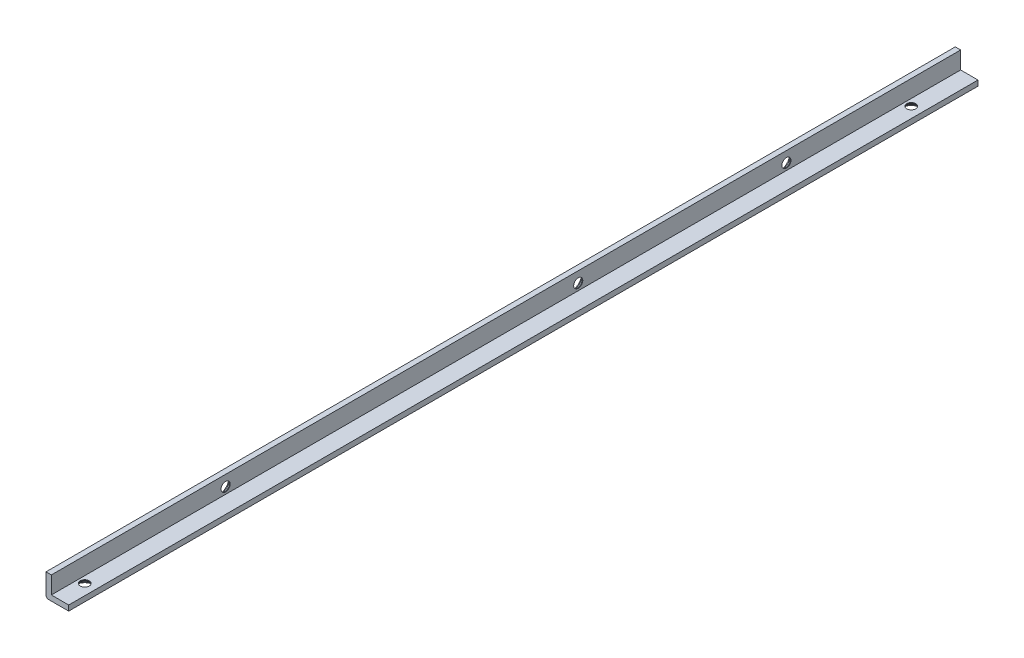
ISO-10303-21;
HEADER;
FILE_DESCRIPTION(('STEP AP214'),'2;1');
FILE_NAME('part.step','',(''),(''),'','','');
FILE_SCHEMA(('AUTOMOTIVE_DESIGN { 1 0 10303 214 1 1 1 1 }'));
ENDSEC;
DATA;
#1=APPLICATION_CONTEXT('core data for automotive mechanical design processes');
#2=APPLICATION_PROTOCOL_DEFINITION('international standard','automotive_design',2000,#1);
#3=PRODUCT_CONTEXT('',#1,'mechanical');
#4=PRODUCT('Part','Part','',(#3));
#5=PRODUCT_RELATED_PRODUCT_CATEGORY('part','',(#4));
#6=PRODUCT_DEFINITION_FORMATION('','',#4);
#7=PRODUCT_DEFINITION_CONTEXT('part definition',#1,'design');
#8=PRODUCT_DEFINITION('design','',#6,#7);
#9=PRODUCT_DEFINITION_SHAPE('','',#8);
#10=(LENGTH_UNIT() NAMED_UNIT(*) SI_UNIT(.MILLI.,.METRE.));
#11=(NAMED_UNIT(*) PLANE_ANGLE_UNIT() SI_UNIT($,.RADIAN.));
#12=(NAMED_UNIT(*) SI_UNIT($,.STERADIAN.) SOLID_ANGLE_UNIT());
#13=UNCERTAINTY_MEASURE_WITH_UNIT(LENGTH_MEASURE(1.E-05),#10,'distance_accuracy_value','');
#14=(GEOMETRIC_REPRESENTATION_CONTEXT(3) GLOBAL_UNCERTAINTY_ASSIGNED_CONTEXT((#13)) GLOBAL_UNIT_ASSIGNED_CONTEXT((#10,
#11,#12)) REPRESENTATION_CONTEXT('',''));
#15=CARTESIAN_POINT('',(0.,0.,0.));
#16=DIRECTION('',(0.,0.,1.));
#17=DIRECTION('',(1.,0.,0.));
#18=AXIS2_PLACEMENT_3D('',#15,#16,#17);
#19=CARTESIAN_POINT('',(0.,2.,340.5));
#20=DIRECTION('',(-1.,0.,0.));
#21=DIRECTION('',(0.,-1.,0.));
#22=AXIS2_PLACEMENT_3D('',#19,#20,#21);
#23=PLANE('',#22);
#24=DIRECTION('',(0.,1.,0.));
#25=VECTOR('',#24,1.);
#26=CARTESIAN_POINT('',(0.,2.,0.));
#27=LINE('',#26,#25);
#28=CARTESIAN_POINT('',(0.,0.,0.));
#29=VERTEX_POINT('',#28);
#30=CARTESIAN_POINT('',(0.,2.,0.));
#31=VERTEX_POINT('',#30);
#32=EDGE_CURVE('E119',#29,#31,#27,.T.);
#33=ORIENTED_EDGE('',*,*,#32,.T.);
#34=DIRECTION('',(0.,0.,-1.));
#35=VECTOR('',#34,1.);
#36=CARTESIAN_POINT('',(0.,2.,340.5));
#37=LINE('',#36,#35);
#38=CARTESIAN_POINT('',(0.,2.,340.5));
#39=VERTEX_POINT('',#38);
#40=EDGE_CURVE('E100',#39,#31,#37,.T.);
#41=ORIENTED_EDGE('',*,*,#40,.F.);
#42=DIRECTION('',(0.,1.,0.));
#43=VECTOR('',#42,1.);
#44=CARTESIAN_POINT('',(0.,2.,340.5));
#45=LINE('',#44,#43);
#46=CARTESIAN_POINT('',(0.,0.,340.5));
#47=VERTEX_POINT('',#46);
#48=EDGE_CURVE('E107',#47,#39,#45,.T.);
#49=ORIENTED_EDGE('',*,*,#48,.F.);
#50=DIRECTION('',(0.,0.,-1.));
#51=VECTOR('',#50,1.);
#52=CARTESIAN_POINT('',(0.,0.,340.5));
#53=LINE('',#52,#51);
#54=EDGE_CURVE('E186',#47,#29,#53,.T.);
#55=ORIENTED_EDGE('',*,*,#54,.T.);
#56=EDGE_LOOP('',(#33,#41,#49,#55));
#57=FACE_BOUND('',#56,.T.);
#58=ADVANCED_FACE('F35',(#57),#23,.F.);
#59=CARTESIAN_POINT('',(-6.5,2.,340.5));
#60=DIRECTION('',(0.,-1.,0.));
#61=DIRECTION('',(0.,0.,-1.));
#62=AXIS2_PLACEMENT_3D('',#59,#60,#61);
#63=PLANE('',#62);
#64=CARTESIAN_POINT('',(-4.00000000000002,2.,330.5));
#65=DIRECTION('',(0.,-1.,0.));
#66=DIRECTION('',(0.,0.,-1.));
#67=AXIS2_PLACEMENT_3D('',#64,#65,#66);
#68=CIRCLE('',#67,1.7);
#69=CARTESIAN_POINT('',(-4.00000000000002,2.,328.8));
#70=VERTEX_POINT('',#69);
#71=EDGE_CURVE('E39',#70,#70,#68,.T.);
#72=ORIENTED_EDGE('',*,*,#71,.T.);
#73=EDGE_LOOP('',(#72));
#74=FACE_BOUND('',#73,.T.);
#75=CARTESIAN_POINT('',(-4.00000000000003,2.,21.));
#76=DIRECTION('',(0.,-1.,0.));
#77=DIRECTION('',(0.,0.,-1.));
#78=AXIS2_PLACEMENT_3D('',#75,#76,#77);
#79=CIRCLE('',#78,1.7);
#80=CARTESIAN_POINT('',(-4.00000000000003,2.,19.3));
#81=VERTEX_POINT('',#80);
#82=EDGE_CURVE('E130',#81,#81,#79,.T.);
#83=ORIENTED_EDGE('',*,*,#82,.T.);
#84=EDGE_LOOP('',(#83));
#85=FACE_BOUND('',#84,.T.);
#86=DIRECTION('',(-1.,0.,0.));
#87=VECTOR('',#86,1.);
#88=CARTESIAN_POINT('',(-6.5,2.,0.));
#89=LINE('',#88,#87);
#90=CARTESIAN_POINT('',(-6.5,2.,0.));
#91=VERTEX_POINT('',#90);
#92=EDGE_CURVE('E188',#31,#91,#89,.T.);
#93=ORIENTED_EDGE('',*,*,#92,.T.);
#94=DIRECTION('',(0.,0.,-1.));
#95=VECTOR('',#94,1.);
#96=CARTESIAN_POINT('',(-6.5,2.,340.5));
#97=LINE('',#96,#95);
#98=CARTESIAN_POINT('',(-6.5,2.,340.5));
#99=VERTEX_POINT('',#98);
#100=EDGE_CURVE('E103',#99,#91,#97,.T.);
#101=ORIENTED_EDGE('',*,*,#100,.F.);
#102=DIRECTION('',(-1.,0.,0.));
#103=VECTOR('',#102,1.);
#104=CARTESIAN_POINT('',(-6.5,2.,340.5));
#105=LINE('',#104,#103);
#106=EDGE_CURVE('E96',#39,#99,#105,.T.);
#107=ORIENTED_EDGE('',*,*,#106,.F.);
#108=ORIENTED_EDGE('',*,*,#40,.T.);
#109=EDGE_LOOP('',(#93,#101,#107,#108));
#110=FACE_BOUND('',#109,.T.);
#111=ADVANCED_FACE('F98',(#74,#85,#110),#63,.F.);
#112=CARTESIAN_POINT('',(-6.5,8.5,340.5));
#113=DIRECTION('',(-1.,0.,0.));
#114=DIRECTION('',(0.,0.,1.));
#115=AXIS2_PLACEMENT_3D('',#112,#113,#114);
#116=PLANE('',#115);
#117=CARTESIAN_POINT('',(-6.5,4.5,275.25));
#118=DIRECTION('',(-1.,0.,0.));
#119=DIRECTION('',(0.,0.,1.));
#120=AXIS2_PLACEMENT_3D('',#117,#118,#119);
#121=CIRCLE('',#120,1.7);
#122=CARTESIAN_POINT('',(-6.5,4.5,276.95));
#123=VERTEX_POINT('',#122);
#124=EDGE_CURVE('E143',#123,#123,#121,.T.);
#125=ORIENTED_EDGE('',*,*,#124,.T.);
#126=EDGE_LOOP('',(#125));
#127=FACE_BOUND('',#126,.T.);
#128=CARTESIAN_POINT('',(-6.5,4.5,143.19999924));
#129=DIRECTION('',(-1.,0.,0.));
#130=DIRECTION('',(0.,0.,1.));
#131=AXIS2_PLACEMENT_3D('',#128,#129,#130);
#132=CIRCLE('',#131,1.7);
#133=CARTESIAN_POINT('',(-6.5,4.5,144.89999924));
#134=VERTEX_POINT('',#133);
#135=EDGE_CURVE('E139',#134,#134,#132,.T.);
#136=ORIENTED_EDGE('',*,*,#135,.T.);
#137=EDGE_LOOP('',(#136));
#138=FACE_BOUND('',#137,.T.);
#139=CARTESIAN_POINT('',(-6.5,4.50000000000001,65.25));
#140=DIRECTION('',(-1.,0.,0.));
#141=DIRECTION('',(0.,0.,1.));
#142=AXIS2_PLACEMENT_3D('',#139,#140,#141);
#143=CIRCLE('',#142,1.7);
#144=CARTESIAN_POINT('',(-6.5,4.50000000000001,66.95));
#145=VERTEX_POINT('',#144);
#146=EDGE_CURVE('E134',#145,#145,#143,.T.);
#147=ORIENTED_EDGE('',*,*,#146,.T.);
#148=EDGE_LOOP('',(#147));
#149=FACE_BOUND('',#148,.T.);
#150=DIRECTION('',(0.,1.,0.));
#151=VECTOR('',#150,1.);
#152=CARTESIAN_POINT('',(-6.5,8.5,0.));
#153=LINE('',#152,#151);
#154=CARTESIAN_POINT('',(-6.5,8.5,0.));
#155=VERTEX_POINT('',#154);
#156=EDGE_CURVE('E190',#91,#155,#153,.T.);
#157=ORIENTED_EDGE('',*,*,#156,.T.);
#158=DIRECTION('',(0.,0.,-1.));
#159=VECTOR('',#158,1.);
#160=CARTESIAN_POINT('',(-6.5,8.5,340.5));
#161=LINE('',#160,#159);
#162=CARTESIAN_POINT('',(-6.5,8.5,340.5));
#163=VERTEX_POINT('',#162);
#164=EDGE_CURVE('E124',#163,#155,#161,.T.);
#165=ORIENTED_EDGE('',*,*,#164,.F.);
#166=DIRECTION('',(0.,1.,0.));
#167=VECTOR('',#166,1.);
#168=CARTESIAN_POINT('',(-6.5,8.5,340.5));
#169=LINE('',#168,#167);
#170=EDGE_CURVE('E106',#99,#163,#169,.T.);
#171=ORIENTED_EDGE('',*,*,#170,.F.);
#172=ORIENTED_EDGE('',*,*,#100,.T.);
#173=EDGE_LOOP('',(#157,#165,#171,#172));
#174=FACE_BOUND('',#173,.T.);
#175=ADVANCED_FACE('F216',(#127,#138,#149,#174),#116,.F.);
#176=CARTESIAN_POINT('',(-8.5,8.5,340.5));
#177=DIRECTION('',(0.,-1.,0.));
#178=DIRECTION('',(0.,0.,-1.));
#179=AXIS2_PLACEMENT_3D('',#176,#177,#178);
#180=PLANE('',#179);
#181=DIRECTION('',(-1.,0.,0.));
#182=VECTOR('',#181,1.);
#183=CARTESIAN_POINT('',(-8.5,8.5,0.));
#184=LINE('',#183,#182);
#185=CARTESIAN_POINT('',(-8.5,8.5,0.));
#186=VERTEX_POINT('',#185);
#187=EDGE_CURVE('E192',#155,#186,#184,.T.);
#188=ORIENTED_EDGE('',*,*,#187,.T.);
#189=DIRECTION('',(0.,0.,-1.));
#190=VECTOR('',#189,1.);
#191=CARTESIAN_POINT('',(-8.5,8.5,340.5));
#192=LINE('',#191,#190);
#193=CARTESIAN_POINT('',(-8.5,8.5,340.5));
#194=VERTEX_POINT('',#193);
#195=EDGE_CURVE('E198',#194,#186,#192,.T.);
#196=ORIENTED_EDGE('',*,*,#195,.F.);
#197=DIRECTION('',(-1.,0.,0.));
#198=VECTOR('',#197,1.);
#199=CARTESIAN_POINT('',(-8.5,8.5,340.5));
#200=LINE('',#199,#198);
#201=EDGE_CURVE('E181',#163,#194,#200,.T.);
#202=ORIENTED_EDGE('',*,*,#201,.F.);
#203=ORIENTED_EDGE('',*,*,#164,.T.);
#204=EDGE_LOOP('',(#188,#196,#202,#203));
#205=FACE_BOUND('',#204,.T.);
#206=ADVANCED_FACE('F205',(#205),#180,.F.);
#207=CARTESIAN_POINT('',(-8.5,0.,340.5));
#208=DIRECTION('',(1.,0.,0.));
#209=DIRECTION('',(0.,0.,-1.));
#210=AXIS2_PLACEMENT_3D('',#207,#208,#209);
#211=PLANE('',#210);
#212=CARTESIAN_POINT('',(-8.5,4.5,275.25));
#213=DIRECTION('',(-1.,0.,0.));
#214=DIRECTION('',(0.,0.,1.));
#215=AXIS2_PLACEMENT_3D('',#212,#213,#214);
#216=CIRCLE('',#215,3.15);
#217=CARTESIAN_POINT('',(-8.5,4.5,278.4));
#218=VERTEX_POINT('',#217);
#219=EDGE_CURVE('E158',#218,#218,#216,.T.);
#220=ORIENTED_EDGE('',*,*,#219,.F.);
#221=EDGE_LOOP('',(#220));
#222=FACE_BOUND('',#221,.T.);
#223=CARTESIAN_POINT('',(-8.5,4.5,143.19999924));
#224=DIRECTION('',(-1.,0.,0.));
#225=DIRECTION('',(0.,0.,1.));
#226=AXIS2_PLACEMENT_3D('',#223,#224,#225);
#227=CIRCLE('',#226,3.15);
#228=CARTESIAN_POINT('',(-8.5,4.5,146.34999924));
#229=VERTEX_POINT('',#228);
#230=EDGE_CURVE('E145',#229,#229,#227,.T.);
#231=ORIENTED_EDGE('',*,*,#230,.F.);
#232=EDGE_LOOP('',(#231));
#233=FACE_BOUND('',#232,.T.);
#234=CARTESIAN_POINT('',(-8.5,4.50000000000001,65.25));
#235=DIRECTION('',(-1.,0.,0.));
#236=DIRECTION('',(0.,0.,1.));
#237=AXIS2_PLACEMENT_3D('',#234,#235,#236);
#238=CIRCLE('',#237,3.15);
#239=CARTESIAN_POINT('',(-8.5,4.50000000000001,68.4));
#240=VERTEX_POINT('',#239);
#241=EDGE_CURVE('E141',#240,#240,#238,.T.);
#242=ORIENTED_EDGE('',*,*,#241,.F.);
#243=EDGE_LOOP('',(#242));
#244=FACE_BOUND('',#243,.T.);
#245=DIRECTION('',(0.,-1.,0.));
#246=VECTOR('',#245,1.);
#247=CARTESIAN_POINT('',(-8.5,0.,0.));
#248=LINE('',#247,#246);
#249=CARTESIAN_POINT('',(-8.5,0.999999999999999,0.));
#250=VERTEX_POINT('',#249);
#251=EDGE_CURVE('E194',#186,#250,#248,.T.);
#252=ORIENTED_EDGE('',*,*,#251,.T.);
#253=DIRECTION('',(0.,0.,-1.));
#254=VECTOR('',#253,1.);
#255=CARTESIAN_POINT('',(-8.5,0.999999999999999,340.5));
#256=LINE('',#255,#254);
#257=CARTESIAN_POINT('',(-8.5,0.999999999999999,340.5));
#258=VERTEX_POINT('',#257);
#259=EDGE_CURVE('E44',#250,#258,#256,.F.);
#260=ORIENTED_EDGE('',*,*,#259,.T.);
#261=DIRECTION('',(0.,-1.,0.));
#262=VECTOR('',#261,1.);
#263=CARTESIAN_POINT('',(-8.5,0.,340.5));
#264=LINE('',#263,#262);
#265=EDGE_CURVE('E183',#194,#258,#264,.T.);
#266=ORIENTED_EDGE('',*,*,#265,.F.);
#267=ORIENTED_EDGE('',*,*,#195,.T.);
#268=EDGE_LOOP('',(#252,#260,#266,#267));
#269=FACE_BOUND('',#268,.T.);
#270=ADVANCED_FACE('F210',(#222,#233,#244,#269),#211,.F.);
#271=CARTESIAN_POINT('',(0.,0.,340.5));
#272=DIRECTION('',(0.,1.,0.));
#273=DIRECTION('',(-1.,0.,0.));
#274=AXIS2_PLACEMENT_3D('',#271,#272,#273);
#275=PLANE('',#274);
#276=CARTESIAN_POINT('',(-4.00000000000002,0.,330.5));
#277=DIRECTION('',(0.,-1.,0.));
#278=DIRECTION('',(0.,0.,-1.));
#279=AXIS2_PLACEMENT_3D('',#276,#277,#278);
#280=CIRCLE('',#279,3.15);
#281=CARTESIAN_POINT('',(-4.00000000000002,0.,327.35));
#282=VERTEX_POINT('',#281);
#283=EDGE_CURVE('E442',#282,#282,#280,.T.);
#284=ORIENTED_EDGE('',*,*,#283,.F.);
#285=EDGE_LOOP('',(#284));
#286=FACE_BOUND('',#285,.T.);
#287=CARTESIAN_POINT('',(-4.00000000000003,0.,21.));
#288=DIRECTION('',(0.,-1.,0.));
#289=DIRECTION('',(0.,0.,-1.));
#290=AXIS2_PLACEMENT_3D('',#287,#288,#289);
#291=CIRCLE('',#290,3.15);
#292=CARTESIAN_POINT('',(-4.00000000000003,0.,17.85));
#293=VERTEX_POINT('',#292);
#294=EDGE_CURVE('E137',#293,#293,#291,.T.);
#295=ORIENTED_EDGE('',*,*,#294,.F.);
#296=EDGE_LOOP('',(#295));
#297=FACE_BOUND('',#296,.T.);
#298=DIRECTION('',(1.,0.,0.));
#299=VECTOR('',#298,1.);
#300=CARTESIAN_POINT('',(0.,0.,340.5));
#301=LINE('',#300,#299);
#302=CARTESIAN_POINT('',(-7.5,0.,340.5));
#303=VERTEX_POINT('',#302);
#304=EDGE_CURVE('E112',#303,#47,#301,.T.);
#305=ORIENTED_EDGE('',*,*,#304,.F.);
#306=DIRECTION('',(0.,0.,-1.));
#307=VECTOR('',#306,1.);
#308=CARTESIAN_POINT('',(-7.5,0.,340.5));
#309=LINE('',#308,#307);
#310=CARTESIAN_POINT('',(-7.5,0.,0.));
#311=VERTEX_POINT('',#310);
#312=EDGE_CURVE('E120',#303,#311,#309,.T.);
#313=ORIENTED_EDGE('',*,*,#312,.T.);
#314=DIRECTION('',(1.,0.,0.));
#315=VECTOR('',#314,1.);
#316=CARTESIAN_POINT('',(0.,0.,0.));
#317=LINE('',#316,#315);
#318=EDGE_CURVE('E116',#311,#29,#317,.T.);
#319=ORIENTED_EDGE('',*,*,#318,.T.);
#320=ORIENTED_EDGE('',*,*,#54,.F.);
#321=EDGE_LOOP('',(#305,#313,#319,#320));
#322=FACE_BOUND('',#321,.T.);
#323=ADVANCED_FACE('F215',(#286,#297,#322),#275,.F.);
#324=CARTESIAN_POINT('',(0.,0.,340.5));
#325=DIRECTION('',(0.,0.,-1.));
#326=DIRECTION('',(-1.,0.,0.));
#327=AXIS2_PLACEMENT_3D('',#324,#325,#326);
#328=PLANE('',#327);
#329=ORIENTED_EDGE('',*,*,#265,.T.);
#330=CARTESIAN_POINT('',(-7.5,0.999999999999999,340.5));
#331=DIRECTION('',(0.,0.,-1.));
#332=DIRECTION('',(-1.,0.,0.));
#333=AXIS2_PLACEMENT_3D('',#330,#331,#332);
#334=CIRCLE('',#333,1.);
#335=EDGE_CURVE('E11',#258,#303,#334,.F.);
#336=ORIENTED_EDGE('',*,*,#335,.T.);
#337=ORIENTED_EDGE('',*,*,#304,.T.);
#338=ORIENTED_EDGE('',*,*,#48,.T.);
#339=ORIENTED_EDGE('',*,*,#106,.T.);
#340=ORIENTED_EDGE('',*,*,#170,.T.);
#341=ORIENTED_EDGE('',*,*,#201,.T.);
#342=EDGE_LOOP('',(#329,#336,#337,#338,#339,#340,#341));
#343=FACE_BOUND('',#342,.T.);
#344=ADVANCED_FACE('F110',(#343),#328,.F.);
#345=CARTESIAN_POINT('',(0.,0.,0.));
#346=DIRECTION('',(0.,0.,-1.));
#347=DIRECTION('',(-1.,0.,0.));
#348=AXIS2_PLACEMENT_3D('',#345,#346,#347);
#349=PLANE('',#348);
#350=ORIENTED_EDGE('',*,*,#318,.F.);
#351=CARTESIAN_POINT('',(-7.5,0.999999999999999,0.));
#352=DIRECTION('',(0.,0.,-1.));
#353=DIRECTION('',(-1.,0.,0.));
#354=AXIS2_PLACEMENT_3D('',#351,#352,#353);
#355=CIRCLE('',#354,1.);
#356=EDGE_CURVE('E59',#311,#250,#355,.T.);
#357=ORIENTED_EDGE('',*,*,#356,.T.);
#358=ORIENTED_EDGE('',*,*,#251,.F.);
#359=ORIENTED_EDGE('',*,*,#187,.F.);
#360=ORIENTED_EDGE('',*,*,#156,.F.);
#361=ORIENTED_EDGE('',*,*,#92,.F.);
#362=ORIENTED_EDGE('',*,*,#32,.F.);
#363=EDGE_LOOP('',(#350,#357,#358,#359,#360,#361,#362));
#364=FACE_BOUND('',#363,.T.);
#365=ADVANCED_FACE('F209',(#364),#349,.T.);
#366=CARTESIAN_POINT('',(-7.5,0.999999999999999,340.5));
#367=DIRECTION('',(0.,0.,-1.));
#368=DIRECTION('',(-1.,0.,0.));
#369=AXIS2_PLACEMENT_3D('',#366,#367,#368);
#370=CYLINDRICAL_SURFACE('',#369,1.);
#371=ORIENTED_EDGE('',*,*,#335,.F.);
#372=ORIENTED_EDGE('',*,*,#259,.F.);
#373=ORIENTED_EDGE('',*,*,#356,.F.);
#374=ORIENTED_EDGE('',*,*,#312,.F.);
#375=EDGE_LOOP('',(#371,#372,#373,#374));
#376=FACE_BOUND('',#375,.T.);
#377=ADVANCED_FACE('F37',(#376),#370,.T.);
#378=CARTESIAN_POINT('',(-4.00000000000003,0.,21.));
#379=DIRECTION('',(0.,-1.,0.));
#380=DIRECTION('',(0.,0.,-1.));
#381=AXIS2_PLACEMENT_3D('',#378,#379,#380);
#382=CYLINDRICAL_SURFACE('',#381,1.7);
#383=CARTESIAN_POINT('',(-4.00000000000003,1.75,21.));
#384=DIRECTION('',(0.,-1.,0.));
#385=DIRECTION('',(0.,0.,-1.));
#386=AXIS2_PLACEMENT_3D('',#383,#384,#385);
#387=CIRCLE('',#386,1.7);
#388=CARTESIAN_POINT('',(-4.00000000000003,1.75,19.3));
#389=VERTEX_POINT('',#388);
#390=EDGE_CURVE('E133',#389,#389,#387,.T.);
#391=ORIENTED_EDGE('',*,*,#390,.T.);
#392=EDGE_LOOP('',(#391));
#393=FACE_BOUND('',#392,.T.);
#394=ORIENTED_EDGE('',*,*,#82,.F.);
#395=EDGE_LOOP('',(#394));
#396=FACE_BOUND('',#395,.T.);
#397=ADVANCED_FACE('F281',(#393,#396),#382,.F.);
#398=CARTESIAN_POINT('',(-4.00000000000003,0.299999999999999,21.));
#399=DIRECTION('',(0.,-1.,0.));
#400=DIRECTION('',(0.,0.,-1.));
#401=AXIS2_PLACEMENT_3D('',#398,#399,#400);
#402=CONICAL_SURFACE('',#401,3.15,0.785398163397448);
#403=ORIENTED_EDGE('',*,*,#390,.F.);
#404=EDGE_LOOP('',(#403));
#405=FACE_BOUND('',#404,.T.);
#406=CARTESIAN_POINT('',(-4.00000000000003,0.299999999999999,21.));
#407=DIRECTION('',(0.,-1.,0.));
#408=DIRECTION('',(0.,0.,-1.));
#409=AXIS2_PLACEMENT_3D('',#406,#407,#408);
#410=CIRCLE('',#409,3.15);
#411=CARTESIAN_POINT('',(-4.00000000000003,0.299999999999999,17.85));
#412=VERTEX_POINT('',#411);
#413=EDGE_CURVE('E175',#412,#412,#410,.T.);
#414=ORIENTED_EDGE('',*,*,#413,.T.);
#415=EDGE_LOOP('',(#414));
#416=FACE_BOUND('',#415,.T.);
#417=ADVANCED_FACE('F286',(#405,#416),#402,.F.);
#418=CARTESIAN_POINT('',(-4.00000000000003,0.,21.));
#419=DIRECTION('',(0.,-1.,0.));
#420=DIRECTION('',(0.,0.,-1.));
#421=AXIS2_PLACEMENT_3D('',#418,#419,#420);
#422=CYLINDRICAL_SURFACE('',#421,3.15);
#423=ORIENTED_EDGE('',*,*,#413,.F.);
#424=EDGE_LOOP('',(#423));
#425=FACE_BOUND('',#424,.T.);
#426=ORIENTED_EDGE('',*,*,#294,.T.);
#427=EDGE_LOOP('',(#426));
#428=FACE_BOUND('',#427,.T.);
#429=ADVANCED_FACE('F294',(#425,#428),#422,.F.);
#430=CARTESIAN_POINT('',(-8.5,4.50000000000001,65.25));
#431=DIRECTION('',(-1.,0.,0.));
#432=DIRECTION('',(0.,0.,1.));
#433=AXIS2_PLACEMENT_3D('',#430,#431,#432);
#434=CYLINDRICAL_SURFACE('',#433,1.7);
#435=CARTESIAN_POINT('',(-6.75,4.50000000000001,65.25));
#436=DIRECTION('',(-1.,0.,0.));
#437=DIRECTION('',(0.,0.,1.));
#438=AXIS2_PLACEMENT_3D('',#435,#436,#437);
#439=CIRCLE('',#438,1.7);
#440=CARTESIAN_POINT('',(-6.75,4.50000000000001,66.95));
#441=VERTEX_POINT('',#440);
#442=EDGE_CURVE('E138',#441,#441,#439,.T.);
#443=ORIENTED_EDGE('',*,*,#442,.T.);
#444=EDGE_LOOP('',(#443));
#445=FACE_BOUND('',#444,.T.);
#446=ORIENTED_EDGE('',*,*,#146,.F.);
#447=EDGE_LOOP('',(#446));
#448=FACE_BOUND('',#447,.T.);
#449=ADVANCED_FACE('F302',(#445,#448),#434,.F.);
#450=CARTESIAN_POINT('',(-8.2,4.50000000000001,65.25));
#451=DIRECTION('',(-1.,0.,0.));
#452=DIRECTION('',(0.,0.,1.));
#453=AXIS2_PLACEMENT_3D('',#450,#451,#452);
#454=CONICAL_SURFACE('',#453,3.15,0.785398163397447);
#455=ORIENTED_EDGE('',*,*,#442,.F.);
#456=EDGE_LOOP('',(#455));
#457=FACE_BOUND('',#456,.T.);
#458=CARTESIAN_POINT('',(-8.2,4.50000000000001,65.25));
#459=DIRECTION('',(-1.,0.,0.));
#460=DIRECTION('',(0.,0.,1.));
#461=AXIS2_PLACEMENT_3D('',#458,#459,#460);
#462=CIRCLE('',#461,3.15);
#463=CARTESIAN_POINT('',(-8.2,4.50000000000001,68.4));
#464=VERTEX_POINT('',#463);
#465=EDGE_CURVE('E168',#464,#464,#462,.T.);
#466=ORIENTED_EDGE('',*,*,#465,.T.);
#467=EDGE_LOOP('',(#466));
#468=FACE_BOUND('',#467,.T.);
#469=ADVANCED_FACE('F310',(#457,#468),#454,.F.);
#470=CARTESIAN_POINT('',(-8.5,4.50000000000001,65.25));
#471=DIRECTION('',(-1.,0.,0.));
#472=DIRECTION('',(0.,0.,1.));
#473=AXIS2_PLACEMENT_3D('',#470,#471,#472);
#474=CYLINDRICAL_SURFACE('',#473,3.15);
#475=ORIENTED_EDGE('',*,*,#465,.F.);
#476=EDGE_LOOP('',(#475));
#477=FACE_BOUND('',#476,.T.);
#478=ORIENTED_EDGE('',*,*,#241,.T.);
#479=EDGE_LOOP('',(#478));
#480=FACE_BOUND('',#479,.T.);
#481=ADVANCED_FACE('F318',(#477,#480),#474,.F.);
#482=CARTESIAN_POINT('',(-8.5,4.5,143.19999924));
#483=DIRECTION('',(-1.,0.,0.));
#484=DIRECTION('',(0.,0.,1.));
#485=AXIS2_PLACEMENT_3D('',#482,#483,#484);
#486=CYLINDRICAL_SURFACE('',#485,1.7);
#487=CARTESIAN_POINT('',(-6.75,4.5,143.19999924));
#488=DIRECTION('',(-1.,0.,0.));
#489=DIRECTION('',(0.,0.,1.));
#490=AXIS2_PLACEMENT_3D('',#487,#488,#489);
#491=CIRCLE('',#490,1.7);
#492=CARTESIAN_POINT('',(-6.75,4.5,144.89999924));
#493=VERTEX_POINT('',#492);
#494=EDGE_CURVE('E142',#493,#493,#491,.T.);
#495=ORIENTED_EDGE('',*,*,#494,.T.);
#496=EDGE_LOOP('',(#495));
#497=FACE_BOUND('',#496,.T.);
#498=ORIENTED_EDGE('',*,*,#135,.F.);
#499=EDGE_LOOP('',(#498));
#500=FACE_BOUND('',#499,.T.);
#501=ADVANCED_FACE('F326',(#497,#500),#486,.F.);
#502=CARTESIAN_POINT('',(-8.2,4.5,143.19999924));
#503=DIRECTION('',(-1.,0.,0.));
#504=DIRECTION('',(0.,0.,1.));
#505=AXIS2_PLACEMENT_3D('',#502,#503,#504);
#506=CONICAL_SURFACE('',#505,3.15,0.785398163397447);
#507=ORIENTED_EDGE('',*,*,#494,.F.);
#508=EDGE_LOOP('',(#507));
#509=FACE_BOUND('',#508,.T.);
#510=CARTESIAN_POINT('',(-8.2,4.5,143.19999924));
#511=DIRECTION('',(-1.,0.,0.));
#512=DIRECTION('',(0.,0.,1.));
#513=AXIS2_PLACEMENT_3D('',#510,#511,#512);
#514=CIRCLE('',#513,3.15);
#515=CARTESIAN_POINT('',(-8.2,4.5,146.34999924));
#516=VERTEX_POINT('',#515);
#517=EDGE_CURVE('E150',#516,#516,#514,.T.);
#518=ORIENTED_EDGE('',*,*,#517,.T.);
#519=EDGE_LOOP('',(#518));
#520=FACE_BOUND('',#519,.T.);
#521=ADVANCED_FACE('F334',(#509,#520),#506,.F.);
#522=CARTESIAN_POINT('',(-8.5,4.5,143.19999924));
#523=DIRECTION('',(-1.,0.,0.));
#524=DIRECTION('',(0.,0.,1.));
#525=AXIS2_PLACEMENT_3D('',#522,#523,#524);
#526=CYLINDRICAL_SURFACE('',#525,3.15);
#527=ORIENTED_EDGE('',*,*,#517,.F.);
#528=EDGE_LOOP('',(#527));
#529=FACE_BOUND('',#528,.T.);
#530=ORIENTED_EDGE('',*,*,#230,.T.);
#531=EDGE_LOOP('',(#530));
#532=FACE_BOUND('',#531,.T.);
#533=ADVANCED_FACE('F342',(#529,#532),#526,.F.);
#534=CARTESIAN_POINT('',(-8.5,4.5,275.25));
#535=DIRECTION('',(-1.,0.,0.));
#536=DIRECTION('',(0.,0.,1.));
#537=AXIS2_PLACEMENT_3D('',#534,#535,#536);
#538=CYLINDRICAL_SURFACE('',#537,1.7);
#539=CARTESIAN_POINT('',(-6.75,4.5,275.25));
#540=DIRECTION('',(-1.,0.,0.));
#541=DIRECTION('',(0.,0.,1.));
#542=AXIS2_PLACEMENT_3D('',#539,#540,#541);
#543=CIRCLE('',#542,1.7);
#544=CARTESIAN_POINT('',(-6.75,4.5,276.95));
#545=VERTEX_POINT('',#544);
#546=EDGE_CURVE('E146',#545,#545,#543,.T.);
#547=ORIENTED_EDGE('',*,*,#546,.T.);
#548=EDGE_LOOP('',(#547));
#549=FACE_BOUND('',#548,.T.);
#550=ORIENTED_EDGE('',*,*,#124,.F.);
#551=EDGE_LOOP('',(#550));
#552=FACE_BOUND('',#551,.T.);
#553=ADVANCED_FACE('F350',(#549,#552),#538,.F.);
#554=CARTESIAN_POINT('',(-8.2,4.5,275.25));
#555=DIRECTION('',(-1.,0.,0.));
#556=DIRECTION('',(0.,0.,1.));
#557=AXIS2_PLACEMENT_3D('',#554,#555,#556);
#558=CONICAL_SURFACE('',#557,3.15,0.785398163397447);
#559=ORIENTED_EDGE('',*,*,#546,.F.);
#560=EDGE_LOOP('',(#559));
#561=FACE_BOUND('',#560,.T.);
#562=CARTESIAN_POINT('',(-8.2,4.5,275.25));
#563=DIRECTION('',(-1.,0.,0.));
#564=DIRECTION('',(0.,0.,1.));
#565=AXIS2_PLACEMENT_3D('',#562,#563,#564);
#566=CIRCLE('',#565,3.15);
#567=CARTESIAN_POINT('',(-8.2,4.5,278.4));
#568=VERTEX_POINT('',#567);
#569=EDGE_CURVE('E153',#568,#568,#566,.T.);
#570=ORIENTED_EDGE('',*,*,#569,.T.);
#571=EDGE_LOOP('',(#570));
#572=FACE_BOUND('',#571,.T.);
#573=ADVANCED_FACE('F358',(#561,#572),#558,.F.);
#574=CARTESIAN_POINT('',(-8.5,4.5,275.25));
#575=DIRECTION('',(-1.,0.,0.));
#576=DIRECTION('',(0.,0.,1.));
#577=AXIS2_PLACEMENT_3D('',#574,#575,#576);
#578=CYLINDRICAL_SURFACE('',#577,3.15);
#579=ORIENTED_EDGE('',*,*,#569,.F.);
#580=EDGE_LOOP('',(#579));
#581=FACE_BOUND('',#580,.T.);
#582=ORIENTED_EDGE('',*,*,#219,.T.);
#583=EDGE_LOOP('',(#582));
#584=FACE_BOUND('',#583,.T.);
#585=ADVANCED_FACE('F365',(#581,#584),#578,.F.);
#586=CARTESIAN_POINT('',(-4.00000000000002,0.,330.5));
#587=DIRECTION('',(0.,-1.,0.));
#588=DIRECTION('',(0.,0.,-1.));
#589=AXIS2_PLACEMENT_3D('',#586,#587,#588);
#590=CYLINDRICAL_SURFACE('',#589,1.7);
#591=CARTESIAN_POINT('',(-4.00000000000002,1.75,330.5));
#592=DIRECTION('',(0.,-1.,0.));
#593=DIRECTION('',(0.,0.,-1.));
#594=AXIS2_PLACEMENT_3D('',#591,#592,#593);
#595=CIRCLE('',#594,1.7);
#596=CARTESIAN_POINT('',(-4.00000000000002,1.75,328.8));
#597=VERTEX_POINT('',#596);
#598=EDGE_CURVE('E444',#597,#597,#595,.T.);
#599=ORIENTED_EDGE('',*,*,#598,.T.);
#600=EDGE_LOOP('',(#599));
#601=FACE_BOUND('',#600,.T.);
#602=ORIENTED_EDGE('',*,*,#71,.F.);
#603=EDGE_LOOP('',(#602));
#604=FACE_BOUND('',#603,.T.);
#605=ADVANCED_FACE('F373',(#601,#604),#590,.F.);
#606=CARTESIAN_POINT('',(-4.00000000000002,0.299999999999999,330.5));
#607=DIRECTION('',(0.,-1.,0.));
#608=DIRECTION('',(0.,0.,-1.));
#609=AXIS2_PLACEMENT_3D('',#606,#607,#608);
#610=CONICAL_SURFACE('',#609,3.15,0.785398163397448);
#611=ORIENTED_EDGE('',*,*,#598,.F.);
#612=EDGE_LOOP('',(#611));
#613=FACE_BOUND('',#612,.T.);
#614=CARTESIAN_POINT('',(-4.00000000000002,0.299999999999999,330.5));
#615=DIRECTION('',(0.,-1.,0.));
#616=DIRECTION('',(0.,0.,-1.));
#617=AXIS2_PLACEMENT_3D('',#614,#615,#616);
#618=CIRCLE('',#617,3.15);
#619=CARTESIAN_POINT('',(-4.00000000000002,0.299999999999999,327.35));
#620=VERTEX_POINT('',#619);
#621=EDGE_CURVE('E439',#620,#620,#618,.T.);
#622=ORIENTED_EDGE('',*,*,#621,.T.);
#623=EDGE_LOOP('',(#622));
#624=FACE_BOUND('',#623,.T.);
#625=ADVANCED_FACE('F381',(#613,#624),#610,.F.);
#626=CARTESIAN_POINT('',(-4.00000000000002,0.,330.5));
#627=DIRECTION('',(0.,-1.,0.));
#628=DIRECTION('',(0.,0.,-1.));
#629=AXIS2_PLACEMENT_3D('',#626,#627,#628);
#630=CYLINDRICAL_SURFACE('',#629,3.15);
#631=ORIENTED_EDGE('',*,*,#621,.F.);
#632=EDGE_LOOP('',(#631));
#633=FACE_BOUND('',#632,.T.);
#634=ORIENTED_EDGE('',*,*,#283,.T.);
#635=EDGE_LOOP('',(#634));
#636=FACE_BOUND('',#635,.T.);
#637=ADVANCED_FACE('F389',(#633,#636),#630,.F.);
#638=CLOSED_SHELL('',(#58,#111,#175,#206,#270,#323,#344,#365,#377,#397,#417,#429,#449,#469,#481,
#501,#521,#533,#553,#573,#585,#605,#625,#637));
#639=MANIFOLD_SOLID_BREP('B2',#638);
#640=ADVANCED_BREP_SHAPE_REPRESENTATION('',(#18,#639),#14);
#641=SHAPE_DEFINITION_REPRESENTATION(#9,#640);
ENDSEC;
END-ISO-10303-21;
